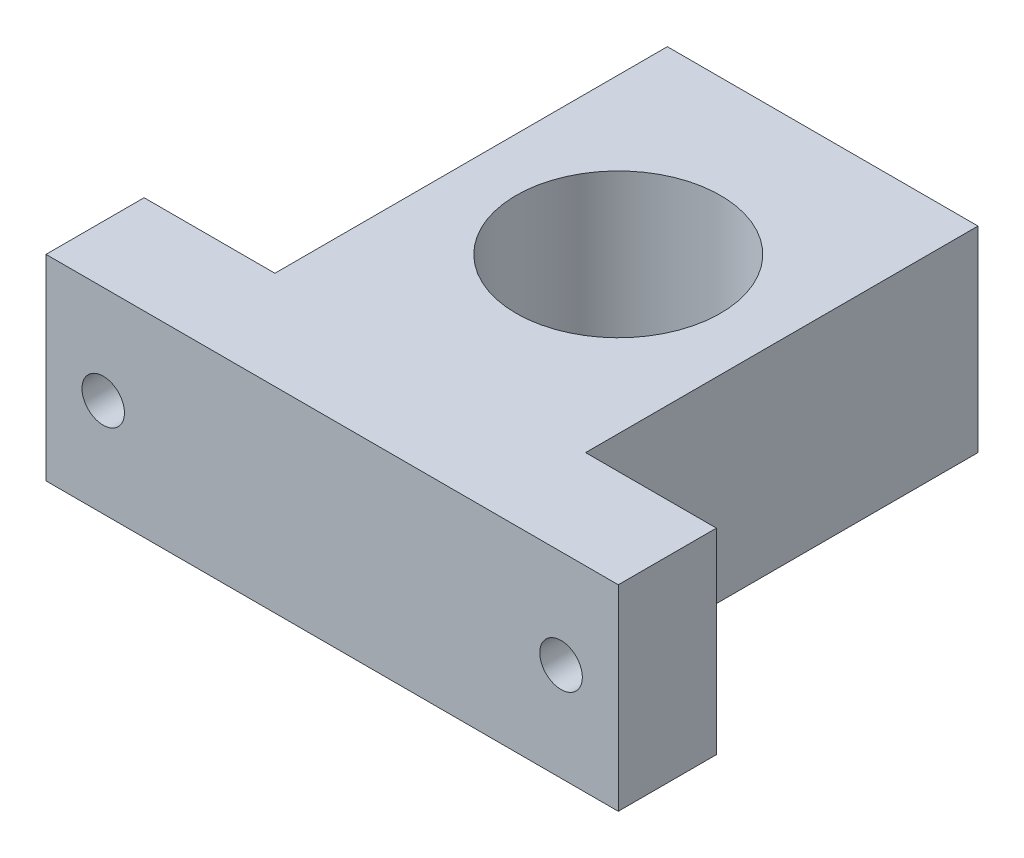
ISO-10303-21;
HEADER;
FILE_DESCRIPTION(('STEP AP214'),'2;1');
FILE_NAME('part.step','',(''),(''),'','','');
FILE_SCHEMA(('AUTOMOTIVE_DESIGN { 1 0 10303 214 1 1 1 1 }'));
ENDSEC;
DATA;
#1=APPLICATION_CONTEXT('core data for automotive mechanical design processes');
#2=APPLICATION_PROTOCOL_DEFINITION('international standard','automotive_design',2000,#1);
#3=PRODUCT_CONTEXT('',#1,'mechanical');
#4=PRODUCT('Part','Part','',(#3));
#5=PRODUCT_RELATED_PRODUCT_CATEGORY('part','',(#4));
#6=PRODUCT_DEFINITION_FORMATION('','',#4);
#7=PRODUCT_DEFINITION_CONTEXT('part definition',#1,'design');
#8=PRODUCT_DEFINITION('design','',#6,#7);
#9=PRODUCT_DEFINITION_SHAPE('','',#8);
#10=(LENGTH_UNIT() NAMED_UNIT(*) SI_UNIT(.MILLI.,.METRE.));
#11=(NAMED_UNIT(*) PLANE_ANGLE_UNIT() SI_UNIT($,.RADIAN.));
#12=(NAMED_UNIT(*) SI_UNIT($,.STERADIAN.) SOLID_ANGLE_UNIT());
#13=UNCERTAINTY_MEASURE_WITH_UNIT(LENGTH_MEASURE(1.E-05),#10,'distance_accuracy_value','');
#14=(GEOMETRIC_REPRESENTATION_CONTEXT(3) GLOBAL_UNCERTAINTY_ASSIGNED_CONTEXT((#13)) GLOBAL_UNIT_ASSIGNED_CONTEXT((#10,
#11,#12)) REPRESENTATION_CONTEXT('',''));
#15=CARTESIAN_POINT('',(0.,0.,0.));
#16=DIRECTION('',(0.,0.,1.));
#17=DIRECTION('',(1.,0.,0.));
#18=AXIS2_PLACEMENT_3D('',#15,#16,#17);
#19=CARTESIAN_POINT('',(0.,24.,0.));
#20=DIRECTION('',(0.,-1.,0.));
#21=DIRECTION('',(0.,0.,-1.));
#22=AXIS2_PLACEMENT_3D('',#19,#20,#21);
#23=PLANE('',#22);
#24=DIRECTION('',(-1.,0.,0.));
#25=VECTOR('',#24,1.);
#26=CARTESIAN_POINT('',(35.,24.,-12.));
#27=LINE('',#26,#25);
#28=CARTESIAN_POINT('',(35.,24.,-12.));
#29=VERTEX_POINT('',#28);
#30=CARTESIAN_POINT('',(19.,24.,-12.));
#31=VERTEX_POINT('',#30);
#32=EDGE_CURVE('E149',#29,#31,#27,.T.);
#33=ORIENTED_EDGE('',*,*,#32,.T.);
#34=DIRECTION('',(0.,0.,-1.));
#35=VECTOR('',#34,1.);
#36=CARTESIAN_POINT('',(19.,24.,-12.));
#37=LINE('',#36,#35);
#38=CARTESIAN_POINT('',(19.,24.,-60.));
#39=VERTEX_POINT('',#38);
#40=EDGE_CURVE('E97',#31,#39,#37,.T.);
#41=ORIENTED_EDGE('',*,*,#40,.T.);
#42=DIRECTION('',(-1.,0.,0.));
#43=VECTOR('',#42,1.);
#44=CARTESIAN_POINT('',(-19.,24.,-60.));
#45=LINE('',#44,#43);
#46=CARTESIAN_POINT('',(-19.,24.,-60.));
#47=VERTEX_POINT('',#46);
#48=EDGE_CURVE('E181',#39,#47,#45,.T.);
#49=ORIENTED_EDGE('',*,*,#48,.T.);
#50=DIRECTION('',(0.,0.,1.));
#51=VECTOR('',#50,1.);
#52=CARTESIAN_POINT('',(-19.,24.,-12.));
#53=LINE('',#52,#51);
#54=CARTESIAN_POINT('',(-19.,24.,-12.));
#55=VERTEX_POINT('',#54);
#56=EDGE_CURVE('E183',#47,#55,#53,.T.);
#57=ORIENTED_EDGE('',*,*,#56,.T.);
#58=DIRECTION('',(-1.,0.,0.));
#59=VECTOR('',#58,1.);
#60=CARTESIAN_POINT('',(-35.,24.,-12.));
#61=LINE('',#60,#59);
#62=CARTESIAN_POINT('',(-35.,24.,-12.));
#63=VERTEX_POINT('',#62);
#64=EDGE_CURVE('E116',#55,#63,#61,.T.);
#65=ORIENTED_EDGE('',*,*,#64,.T.);
#66=DIRECTION('',(0.,0.,1.));
#67=VECTOR('',#66,1.);
#68=CARTESIAN_POINT('',(-35.,24.,0.));
#69=LINE('',#68,#67);
#70=CARTESIAN_POINT('',(-35.,24.,0.));
#71=VERTEX_POINT('',#70);
#72=EDGE_CURVE('E110',#63,#71,#69,.T.);
#73=ORIENTED_EDGE('',*,*,#72,.T.);
#74=DIRECTION('',(1.,0.,0.));
#75=VECTOR('',#74,1.);
#76=CARTESIAN_POINT('',(35.,24.,0.));
#77=LINE('',#76,#75);
#78=CARTESIAN_POINT('',(35.,24.,0.));
#79=VERTEX_POINT('',#78);
#80=EDGE_CURVE('E114',#71,#79,#77,.T.);
#81=ORIENTED_EDGE('',*,*,#80,.T.);
#82=DIRECTION('',(0.,0.,-1.));
#83=VECTOR('',#82,1.);
#84=CARTESIAN_POINT('',(35.,24.,0.));
#85=LINE('',#84,#83);
#86=EDGE_CURVE('E54',#79,#29,#85,.T.);
#87=ORIENTED_EDGE('',*,*,#86,.T.);
#88=EDGE_LOOP('',(#33,#41,#49,#57,#65,#73,#81,#87));
#89=FACE_BOUND('',#88,.T.);
#90=CARTESIAN_POINT('',(0.,24.,-35.));
#91=DIRECTION('',(0.,1.,0.));
#92=DIRECTION('',(0.,0.,1.));
#93=AXIS2_PLACEMENT_3D('',#90,#91,#92);
#94=CIRCLE('',#93,12.5);
#95=CARTESIAN_POINT('',(0.,24.,-22.5));
#96=VERTEX_POINT('',#95);
#97=EDGE_CURVE('E138',#96,#96,#94,.T.);
#98=ORIENTED_EDGE('',*,*,#97,.F.);
#99=EDGE_LOOP('',(#98));
#100=FACE_BOUND('',#99,.T.);
#101=ADVANCED_FACE('F35',(#89,#100),#23,.F.);
#102=CARTESIAN_POINT('',(0.,0.,0.));
#103=DIRECTION('',(0.,-1.,0.));
#104=DIRECTION('',(0.,0.,-1.));
#105=AXIS2_PLACEMENT_3D('',#102,#103,#104);
#106=PLANE('',#105);
#107=DIRECTION('',(-1.,0.,0.));
#108=VECTOR('',#107,1.);
#109=CARTESIAN_POINT('',(35.,0.,-12.));
#110=LINE('',#109,#108);
#111=CARTESIAN_POINT('',(35.,0.,-12.));
#112=VERTEX_POINT('',#111);
#113=CARTESIAN_POINT('',(19.,0.,-12.));
#114=VERTEX_POINT('',#113);
#115=EDGE_CURVE('E134',#112,#114,#110,.T.);
#116=ORIENTED_EDGE('',*,*,#115,.F.);
#117=DIRECTION('',(0.,0.,-1.));
#118=VECTOR('',#117,1.);
#119=CARTESIAN_POINT('',(35.,0.,0.));
#120=LINE('',#119,#118);
#121=CARTESIAN_POINT('',(35.,0.,0.));
#122=VERTEX_POINT('',#121);
#123=EDGE_CURVE('E89',#122,#112,#120,.T.);
#124=ORIENTED_EDGE('',*,*,#123,.F.);
#125=DIRECTION('',(1.,0.,0.));
#126=VECTOR('',#125,1.);
#127=CARTESIAN_POINT('',(35.,0.,0.));
#128=LINE('',#127,#126);
#129=CARTESIAN_POINT('',(-35.,0.,0.));
#130=VERTEX_POINT('',#129);
#131=EDGE_CURVE('E83',#130,#122,#128,.T.);
#132=ORIENTED_EDGE('',*,*,#131,.F.);
#133=DIRECTION('',(0.,0.,1.));
#134=VECTOR('',#133,1.);
#135=CARTESIAN_POINT('',(-35.,0.,0.));
#136=LINE('',#135,#134);
#137=CARTESIAN_POINT('',(-35.,0.,-12.));
#138=VERTEX_POINT('',#137);
#139=EDGE_CURVE('E124',#138,#130,#136,.T.);
#140=ORIENTED_EDGE('',*,*,#139,.F.);
#141=DIRECTION('',(-1.,0.,0.));
#142=VECTOR('',#141,1.);
#143=CARTESIAN_POINT('',(-35.,0.,-12.));
#144=LINE('',#143,#142);
#145=CARTESIAN_POINT('',(-19.,0.,-12.));
#146=VERTEX_POINT('',#145);
#147=EDGE_CURVE('E144',#146,#138,#144,.T.);
#148=ORIENTED_EDGE('',*,*,#147,.F.);
#149=DIRECTION('',(0.,0.,1.));
#150=VECTOR('',#149,1.);
#151=CARTESIAN_POINT('',(-19.,0.,-12.));
#152=LINE('',#151,#150);
#153=CARTESIAN_POINT('',(-19.,0.,-60.));
#154=VERTEX_POINT('',#153);
#155=EDGE_CURVE('E142',#154,#146,#152,.T.);
#156=ORIENTED_EDGE('',*,*,#155,.F.);
#157=DIRECTION('',(-1.,0.,0.));
#158=VECTOR('',#157,1.);
#159=CARTESIAN_POINT('',(-19.,0.,-60.));
#160=LINE('',#159,#158);
#161=CARTESIAN_POINT('',(19.,0.,-60.));
#162=VERTEX_POINT('',#161);
#163=EDGE_CURVE('E140',#162,#154,#160,.T.);
#164=ORIENTED_EDGE('',*,*,#163,.F.);
#165=DIRECTION('',(0.,0.,-1.));
#166=VECTOR('',#165,1.);
#167=CARTESIAN_POINT('',(19.,0.,-12.));
#168=LINE('',#167,#166);
#169=EDGE_CURVE('E137',#114,#162,#168,.T.);
#170=ORIENTED_EDGE('',*,*,#169,.F.);
#171=EDGE_LOOP('',(#116,#124,#132,#140,#148,#156,#164,#170));
#172=FACE_BOUND('',#171,.T.);
#173=CARTESIAN_POINT('',(0.,0.,-35.));
#174=DIRECTION('',(0.,1.,0.));
#175=DIRECTION('',(0.,0.,1.));
#176=AXIS2_PLACEMENT_3D('',#173,#174,#175);
#177=CIRCLE('',#176,12.5);
#178=CARTESIAN_POINT('',(0.,0.,-22.5));
#179=VERTEX_POINT('',#178);
#180=EDGE_CURVE('E166',#179,#179,#177,.T.);
#181=ORIENTED_EDGE('',*,*,#180,.T.);
#182=EDGE_LOOP('',(#181));
#183=FACE_BOUND('',#182,.T.);
#184=ADVANCED_FACE('F196',(#172,#183),#106,.T.);
#185=CARTESIAN_POINT('',(35.,24.,-12.));
#186=DIRECTION('',(0.,0.,1.));
#187=DIRECTION('',(1.,0.,0.));
#188=AXIS2_PLACEMENT_3D('',#185,#186,#187);
#189=PLANE('',#188);
#190=CARTESIAN_POINT('',(28.,12.,-12.));
#191=DIRECTION('',(0.,0.,-1.));
#192=DIRECTION('',(-1.,0.,0.));
#193=AXIS2_PLACEMENT_3D('',#190,#191,#192);
#194=CIRCLE('',#193,2.6);
#195=CARTESIAN_POINT('',(25.4,12.,-12.));
#196=VERTEX_POINT('',#195);
#197=EDGE_CURVE('E162',#196,#196,#194,.T.);
#198=ORIENTED_EDGE('',*,*,#197,.F.);
#199=EDGE_LOOP('',(#198));
#200=FACE_BOUND('',#199,.T.);
#201=ORIENTED_EDGE('',*,*,#115,.T.);
#202=DIRECTION('',(0.,-1.,0.));
#203=VECTOR('',#202,1.);
#204=CARTESIAN_POINT('',(19.,24.,-12.));
#205=LINE('',#204,#203);
#206=EDGE_CURVE('E11',#31,#114,#205,.T.);
#207=ORIENTED_EDGE('',*,*,#206,.F.);
#208=ORIENTED_EDGE('',*,*,#32,.F.);
#209=DIRECTION('',(0.,-1.,0.));
#210=VECTOR('',#209,1.);
#211=CARTESIAN_POINT('',(35.,24.,-12.));
#212=LINE('',#211,#210);
#213=EDGE_CURVE('E130',#29,#112,#212,.T.);
#214=ORIENTED_EDGE('',*,*,#213,.T.);
#215=EDGE_LOOP('',(#201,#207,#208,#214));
#216=FACE_BOUND('',#215,.T.);
#217=ADVANCED_FACE('F37',(#200,#216),#189,.F.);
#218=CARTESIAN_POINT('',(19.,24.,-12.));
#219=DIRECTION('',(-1.,0.,0.));
#220=DIRECTION('',(0.,0.,1.));
#221=AXIS2_PLACEMENT_3D('',#218,#219,#220);
#222=PLANE('',#221);
#223=ORIENTED_EDGE('',*,*,#169,.T.);
#224=DIRECTION('',(0.,-1.,0.));
#225=VECTOR('',#224,1.);
#226=CARTESIAN_POINT('',(19.,24.,-60.));
#227=LINE('',#226,#225);
#228=EDGE_CURVE('E45',#39,#162,#227,.T.);
#229=ORIENTED_EDGE('',*,*,#228,.F.);
#230=ORIENTED_EDGE('',*,*,#40,.F.);
#231=ORIENTED_EDGE('',*,*,#206,.T.);
#232=EDGE_LOOP('',(#223,#229,#230,#231));
#233=FACE_BOUND('',#232,.T.);
#234=ADVANCED_FACE('F252',(#233),#222,.F.);
#235=CARTESIAN_POINT('',(-19.,24.,-60.));
#236=DIRECTION('',(0.,0.,1.));
#237=DIRECTION('',(1.,0.,0.));
#238=AXIS2_PLACEMENT_3D('',#235,#236,#237);
#239=PLANE('',#238);
#240=ORIENTED_EDGE('',*,*,#163,.T.);
#241=DIRECTION('',(0.,-1.,0.));
#242=VECTOR('',#241,1.);
#243=CARTESIAN_POINT('',(-19.,24.,-60.));
#244=LINE('',#243,#242);
#245=EDGE_CURVE('E156',#47,#154,#244,.T.);
#246=ORIENTED_EDGE('',*,*,#245,.F.);
#247=ORIENTED_EDGE('',*,*,#48,.F.);
#248=ORIENTED_EDGE('',*,*,#228,.T.);
#249=EDGE_LOOP('',(#240,#246,#247,#248));
#250=FACE_BOUND('',#249,.T.);
#251=ADVANCED_FACE('F285',(#250),#239,.F.);
#252=CARTESIAN_POINT('',(-19.,24.,-12.));
#253=DIRECTION('',(1.,0.,0.));
#254=DIRECTION('',(0.,0.,-1.));
#255=AXIS2_PLACEMENT_3D('',#252,#253,#254);
#256=PLANE('',#255);
#257=ORIENTED_EDGE('',*,*,#155,.T.);
#258=DIRECTION('',(0.,-1.,0.));
#259=VECTOR('',#258,1.);
#260=CARTESIAN_POINT('',(-19.,24.,-12.));
#261=LINE('',#260,#259);
#262=EDGE_CURVE('E153',#55,#146,#261,.T.);
#263=ORIENTED_EDGE('',*,*,#262,.F.);
#264=ORIENTED_EDGE('',*,*,#56,.F.);
#265=ORIENTED_EDGE('',*,*,#245,.T.);
#266=EDGE_LOOP('',(#257,#263,#264,#265));
#267=FACE_BOUND('',#266,.T.);
#268=ADVANCED_FACE('F189',(#267),#256,.F.);
#269=CARTESIAN_POINT('',(-35.,24.,-12.));
#270=DIRECTION('',(0.,0.,1.));
#271=DIRECTION('',(1.,0.,0.));
#272=AXIS2_PLACEMENT_3D('',#269,#270,#271);
#273=PLANE('',#272);
#274=CARTESIAN_POINT('',(-28.,12.,-12.));
#275=DIRECTION('',(0.,0.,-1.));
#276=DIRECTION('',(1.,0.,0.));
#277=AXIS2_PLACEMENT_3D('',#274,#275,#276);
#278=CIRCLE('',#277,2.6);
#279=CARTESIAN_POINT('',(-25.4,12.,-12.));
#280=VERTEX_POINT('',#279);
#281=EDGE_CURVE('E168',#280,#280,#278,.T.);
#282=ORIENTED_EDGE('',*,*,#281,.F.);
#283=EDGE_LOOP('',(#282));
#284=FACE_BOUND('',#283,.T.);
#285=ORIENTED_EDGE('',*,*,#147,.T.);
#286=DIRECTION('',(0.,-1.,0.));
#287=VECTOR('',#286,1.);
#288=CARTESIAN_POINT('',(-35.,24.,-12.));
#289=LINE('',#288,#287);
#290=EDGE_CURVE('E125',#63,#138,#289,.T.);
#291=ORIENTED_EDGE('',*,*,#290,.F.);
#292=ORIENTED_EDGE('',*,*,#64,.F.);
#293=ORIENTED_EDGE('',*,*,#262,.T.);
#294=EDGE_LOOP('',(#285,#291,#292,#293));
#295=FACE_BOUND('',#294,.T.);
#296=ADVANCED_FACE('F193',(#284,#295),#273,.F.);
#297=CARTESIAN_POINT('',(-35.,24.,0.));
#298=DIRECTION('',(1.,0.,0.));
#299=DIRECTION('',(0.,0.,-1.));
#300=AXIS2_PLACEMENT_3D('',#297,#298,#299);
#301=PLANE('',#300);
#302=ORIENTED_EDGE('',*,*,#139,.T.);
#303=DIRECTION('',(0.,-1.,0.));
#304=VECTOR('',#303,1.);
#305=CARTESIAN_POINT('',(-35.,24.,0.));
#306=LINE('',#305,#304);
#307=EDGE_CURVE('E121',#71,#130,#306,.T.);
#308=ORIENTED_EDGE('',*,*,#307,.F.);
#309=ORIENTED_EDGE('',*,*,#72,.F.);
#310=ORIENTED_EDGE('',*,*,#290,.T.);
#311=EDGE_LOOP('',(#302,#308,#309,#310));
#312=FACE_BOUND('',#311,.T.);
#313=ADVANCED_FACE('F122',(#312),#301,.F.);
#314=CARTESIAN_POINT('',(35.,24.,0.));
#315=DIRECTION('',(0.,0.,-1.));
#316=DIRECTION('',(-1.,0.,0.));
#317=AXIS2_PLACEMENT_3D('',#314,#315,#316);
#318=PLANE('',#317);
#319=CARTESIAN_POINT('',(28.,12.,0.));
#320=DIRECTION('',(0.,0.,-1.));
#321=DIRECTION('',(-1.,0.,0.));
#322=AXIS2_PLACEMENT_3D('',#319,#320,#321);
#323=CIRCLE('',#322,2.6);
#324=CARTESIAN_POINT('',(25.4,12.,0.));
#325=VERTEX_POINT('',#324);
#326=EDGE_CURVE('E39',#325,#325,#323,.T.);
#327=ORIENTED_EDGE('',*,*,#326,.T.);
#328=EDGE_LOOP('',(#327));
#329=FACE_BOUND('',#328,.T.);
#330=CARTESIAN_POINT('',(-28.,12.,0.));
#331=DIRECTION('',(0.,0.,-1.));
#332=DIRECTION('',(-1.,0.,0.));
#333=AXIS2_PLACEMENT_3D('',#330,#331,#332);
#334=CIRCLE('',#333,2.6);
#335=CARTESIAN_POINT('',(-30.6,12.,0.));
#336=VERTEX_POINT('',#335);
#337=EDGE_CURVE('E160',#336,#336,#334,.T.);
#338=ORIENTED_EDGE('',*,*,#337,.T.);
#339=EDGE_LOOP('',(#338));
#340=FACE_BOUND('',#339,.T.);
#341=ORIENTED_EDGE('',*,*,#131,.T.);
#342=DIRECTION('',(0.,-1.,0.));
#343=VECTOR('',#342,1.);
#344=CARTESIAN_POINT('',(35.,24.,0.));
#345=LINE('',#344,#343);
#346=EDGE_CURVE('E126',#79,#122,#345,.T.);
#347=ORIENTED_EDGE('',*,*,#346,.F.);
#348=ORIENTED_EDGE('',*,*,#80,.F.);
#349=ORIENTED_EDGE('',*,*,#307,.T.);
#350=EDGE_LOOP('',(#341,#347,#348,#349));
#351=FACE_BOUND('',#350,.T.);
#352=ADVANCED_FACE('F128',(#329,#340,#351),#318,.F.);
#353=CARTESIAN_POINT('',(35.,24.,0.));
#354=DIRECTION('',(-1.,0.,0.));
#355=DIRECTION('',(0.,0.,1.));
#356=AXIS2_PLACEMENT_3D('',#353,#354,#355);
#357=PLANE('',#356);
#358=ORIENTED_EDGE('',*,*,#123,.T.);
#359=ORIENTED_EDGE('',*,*,#213,.F.);
#360=ORIENTED_EDGE('',*,*,#86,.F.);
#361=ORIENTED_EDGE('',*,*,#346,.T.);
#362=EDGE_LOOP('',(#358,#359,#360,#361));
#363=FACE_BOUND('',#362,.T.);
#364=ADVANCED_FACE('F202',(#363),#357,.F.);
#365=CARTESIAN_POINT('',(0.,24.,-35.));
#366=DIRECTION('',(0.,-1.,0.));
#367=DIRECTION('',(0.,0.,-1.));
#368=AXIS2_PLACEMENT_3D('',#365,#366,#367);
#369=CYLINDRICAL_SURFACE('',#368,12.5);
#370=ORIENTED_EDGE('',*,*,#97,.T.);
#371=EDGE_LOOP('',(#370));
#372=FACE_BOUND('',#371,.T.);
#373=ORIENTED_EDGE('',*,*,#180,.F.);
#374=EDGE_LOOP('',(#373));
#375=FACE_BOUND('',#374,.T.);
#376=ADVANCED_FACE('F204',(#372,#375),#369,.F.);
#377=CARTESIAN_POINT('',(-28.,12.,12.));
#378=DIRECTION('',(0.,0.,-1.));
#379=DIRECTION('',(-1.,0.,0.));
#380=AXIS2_PLACEMENT_3D('',#377,#378,#379);
#381=CYLINDRICAL_SURFACE('',#380,2.6);
#382=ORIENTED_EDGE('',*,*,#281,.T.);
#383=EDGE_LOOP('',(#382));
#384=FACE_BOUND('',#383,.T.);
#385=ORIENTED_EDGE('',*,*,#337,.F.);
#386=EDGE_LOOP('',(#385));
#387=FACE_BOUND('',#386,.T.);
#388=ADVANCED_FACE('F210',(#384,#387),#381,.F.);
#389=CARTESIAN_POINT('',(28.,12.,12.));
#390=DIRECTION('',(0.,0.,-1.));
#391=DIRECTION('',(-1.,0.,0.));
#392=AXIS2_PLACEMENT_3D('',#389,#390,#391);
#393=CYLINDRICAL_SURFACE('',#392,2.6);
#394=ORIENTED_EDGE('',*,*,#197,.T.);
#395=EDGE_LOOP('',(#394));
#396=FACE_BOUND('',#395,.T.);
#397=ORIENTED_EDGE('',*,*,#326,.F.);
#398=EDGE_LOOP('',(#397));
#399=FACE_BOUND('',#398,.T.);
#400=ADVANCED_FACE('F224',(#396,#399),#393,.F.);
#401=CLOSED_SHELL('',(#101,#184,#217,#234,#251,#268,#296,#313,#352,#364,#376,#388,#400));
#402=MANIFOLD_SOLID_BREP('B2',#401);
#403=ADVANCED_BREP_SHAPE_REPRESENTATION('',(#18,#402),#14);
#404=SHAPE_DEFINITION_REPRESENTATION(#9,#403);
ENDSEC;
END-ISO-10303-21;
